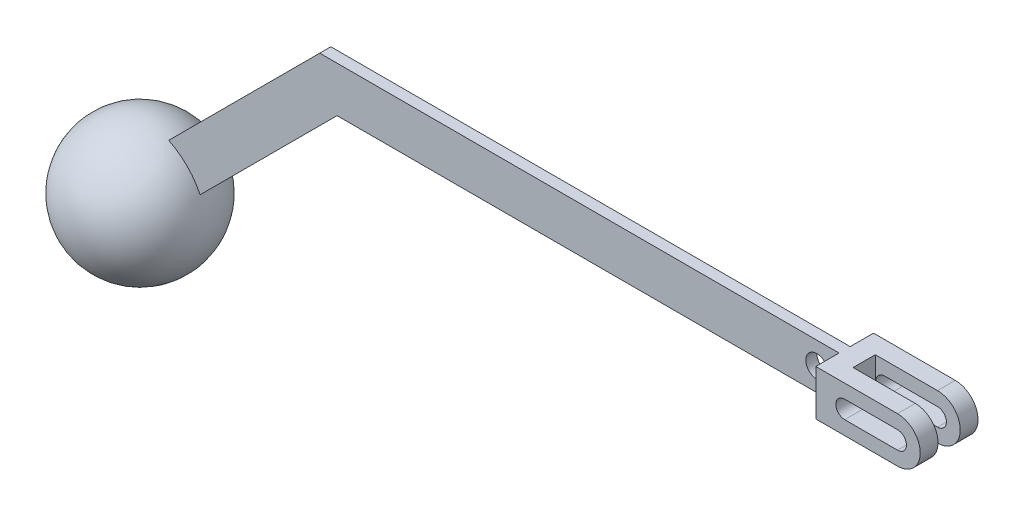
ISO-10303-21;
HEADER;
FILE_DESCRIPTION(('STEP AP214'),'2;1');
FILE_NAME('part.step','',(''),(''),'','','');
FILE_SCHEMA(('AUTOMOTIVE_DESIGN { 1 0 10303 214 1 1 1 1 }'));
ENDSEC;
DATA;
#1=APPLICATION_CONTEXT('core data for automotive mechanical design processes');
#2=APPLICATION_PROTOCOL_DEFINITION('international standard','automotive_design',2000,#1);
#3=PRODUCT_CONTEXT('',#1,'mechanical');
#4=PRODUCT('Part','Part','',(#3));
#5=PRODUCT_RELATED_PRODUCT_CATEGORY('part','',(#4));
#6=PRODUCT_DEFINITION_FORMATION('','',#4);
#7=PRODUCT_DEFINITION_CONTEXT('part definition',#1,'design');
#8=PRODUCT_DEFINITION('design','',#6,#7);
#9=PRODUCT_DEFINITION_SHAPE('','',#8);
#10=(LENGTH_UNIT() NAMED_UNIT(*) SI_UNIT(.MILLI.,.METRE.));
#11=(NAMED_UNIT(*) PLANE_ANGLE_UNIT() SI_UNIT($,.RADIAN.));
#12=(NAMED_UNIT(*) SI_UNIT($,.STERADIAN.) SOLID_ANGLE_UNIT());
#13=UNCERTAINTY_MEASURE_WITH_UNIT(LENGTH_MEASURE(1.E-05),#10,'distance_accuracy_value','');
#14=(GEOMETRIC_REPRESENTATION_CONTEXT(3) GLOBAL_UNCERTAINTY_ASSIGNED_CONTEXT((#13)) GLOBAL_UNIT_ASSIGNED_CONTEXT((#10,
#11,#12)) REPRESENTATION_CONTEXT('',''));
#15=CARTESIAN_POINT('',(0.,0.,0.));
#16=DIRECTION('',(0.,0.,1.));
#17=DIRECTION('',(1.,0.,0.));
#18=AXIS2_PLACEMENT_3D('',#15,#16,#17);
#19=CARTESIAN_POINT('',(29.1954306267144,4.,5.));
#20=DIRECTION('',(0.,-1.,0.));
#21=DIRECTION('',(0.,0.,-1.));
#22=AXIS2_PLACEMENT_3D('',#19,#20,#21);
#23=PLANE('',#22);
#24=DIRECTION('',(-1.,0.,0.));
#25=VECTOR('',#24,1.);
#26=CARTESIAN_POINT('',(29.1954306267144,4.,7.5));
#27=LINE('',#26,#25);
#28=CARTESIAN_POINT('',(8.,4.,7.5));
#29=VERTEX_POINT('',#28);
#30=CARTESIAN_POINT('',(-15.8045693732856,4.,7.5));
#31=VERTEX_POINT('',#30);
#32=EDGE_CURVE('E295',#29,#31,#27,.T.);
#33=ORIENTED_EDGE('',*,*,#32,.F.);
#34=DIRECTION('',(0.,0.,1.));
#35=VECTOR('',#34,1.);
#36=CARTESIAN_POINT('',(8.,4.,-39.4485108999575));
#37=LINE('',#36,#35);
#38=CARTESIAN_POINT('',(8.,4.,15.5));
#39=VERTEX_POINT('',#38);
#40=EDGE_CURVE('E342',#39,#29,#37,.F.);
#41=ORIENTED_EDGE('',*,*,#40,.F.);
#42=DIRECTION('',(1.,0.,0.));
#43=VECTOR('',#42,1.);
#44=CARTESIAN_POINT('',(29.1954306267144,4.,15.5));
#45=LINE('',#44,#43);
#46=CARTESIAN_POINT('',(-15.8045693732856,4.,15.5));
#47=VERTEX_POINT('',#46);
#48=EDGE_CURVE('E281',#47,#39,#45,.T.);
#49=ORIENTED_EDGE('',*,*,#48,.F.);
#50=DIRECTION('',(0.,0.,-1.));
#51=VECTOR('',#50,1.);
#52=CARTESIAN_POINT('',(-15.8045693732856,4.,5.));
#53=LINE('',#52,#51);
#54=EDGE_CURVE('E317',#47,#31,#53,.T.);
#55=ORIENTED_EDGE('',*,*,#54,.T.);
#56=EDGE_LOOP('',(#33,#41,#49,#55));
#57=FACE_BOUND('',#56,.T.);
#58=ADVANCED_FACE('F35',(#57),#23,.T.);
#59=CARTESIAN_POINT('',(8.,4.,-2.5));
#60=VERTEX_POINT('',#59);
#61=CARTESIAN_POINT('',(8.,4.,-10.5));
#62=VERTEX_POINT('',#61);
#63=EDGE_CURVE('E341',#60,#62,#37,.F.);
#64=ORIENTED_EDGE('',*,*,#63,.F.);
#65=DIRECTION('',(1.,0.,0.));
#66=VECTOR('',#65,1.);
#67=CARTESIAN_POINT('',(29.1954306267144,4.,-2.5));
#68=LINE('',#67,#66);
#69=CARTESIAN_POINT('',(-15.8045693732856,4.,-2.5));
#70=VERTEX_POINT('',#69);
#71=EDGE_CURVE('E291',#70,#60,#68,.T.);
#72=ORIENTED_EDGE('',*,*,#71,.F.);
#73=CARTESIAN_POINT('',(-15.8045693732856,4.,-10.5));
#74=VERTEX_POINT('',#73);
#75=EDGE_CURVE('E316',#70,#74,#53,.T.);
#76=ORIENTED_EDGE('',*,*,#75,.T.);
#77=DIRECTION('',(-1.,0.,0.));
#78=VECTOR('',#77,1.);
#79=CARTESIAN_POINT('',(29.1954306267144,4.,-10.5));
#80=LINE('',#79,#78);
#81=EDGE_CURVE('E265',#62,#74,#80,.T.);
#82=ORIENTED_EDGE('',*,*,#81,.F.);
#83=EDGE_LOOP('',(#64,#72,#76,#82));
#84=FACE_BOUND('',#83,.T.);
#85=ADVANCED_FACE('F431',(#84),#23,.T.);
#86=CARTESIAN_POINT('',(-15.8045693732856,-4.,5.));
#87=DIRECTION('',(0.,1.,0.));
#88=DIRECTION('',(0.,0.,1.));
#89=AXIS2_PLACEMENT_3D('',#86,#87,#88);
#90=PLANE('',#89);
#91=DIRECTION('',(0.,0.,1.));
#92=VECTOR('',#91,1.);
#93=CARTESIAN_POINT('',(8.,-4.,-39.4485108999575));
#94=LINE('',#93,#92);
#95=CARTESIAN_POINT('',(8.,-4.,15.5));
#96=VERTEX_POINT('',#95);
#97=CARTESIAN_POINT('',(8.,-4.,7.5));
#98=VERTEX_POINT('',#97);
#99=EDGE_CURVE('E338',#96,#98,#94,.F.);
#100=ORIENTED_EDGE('',*,*,#99,.T.);
#101=DIRECTION('',(1.,0.,0.));
#102=VECTOR('',#101,1.);
#103=CARTESIAN_POINT('',(-15.8045693732856,-4.,7.5));
#104=LINE('',#103,#102);
#105=CARTESIAN_POINT('',(-15.8045693732856,-4.,7.5));
#106=VERTEX_POINT('',#105);
#107=EDGE_CURVE('E57',#106,#98,#104,.T.);
#108=ORIENTED_EDGE('',*,*,#107,.F.);
#109=DIRECTION('',(0.,0.,-1.));
#110=VECTOR('',#109,1.);
#111=CARTESIAN_POINT('',(-15.8045693732856,-4.,5.));
#112=LINE('',#111,#110);
#113=CARTESIAN_POINT('',(-15.8045693732856,-4.,15.5));
#114=VERTEX_POINT('',#113);
#115=EDGE_CURVE('E314',#114,#106,#112,.T.);
#116=ORIENTED_EDGE('',*,*,#115,.F.);
#117=DIRECTION('',(-1.,0.,0.));
#118=VECTOR('',#117,1.);
#119=CARTESIAN_POINT('',(-15.8045693732856,-4.,15.5));
#120=LINE('',#119,#118);
#121=EDGE_CURVE('E277',#96,#114,#120,.T.);
#122=ORIENTED_EDGE('',*,*,#121,.F.);
#123=EDGE_LOOP('',(#100,#108,#116,#122));
#124=FACE_BOUND('',#123,.T.);
#125=ADVANCED_FACE('F362',(#124),#90,.T.);
#126=DIRECTION('',(-1.,0.,0.));
#127=VECTOR('',#126,1.);
#128=CARTESIAN_POINT('',(-15.8045693732856,-4.,-2.5));
#129=LINE('',#128,#127);
#130=CARTESIAN_POINT('',(8.,-4.,-2.5));
#131=VERTEX_POINT('',#130);
#132=CARTESIAN_POINT('',(-15.8045693732856,-4.,-2.5));
#133=VERTEX_POINT('',#132);
#134=EDGE_CURVE('E326',#131,#133,#129,.T.);
#135=ORIENTED_EDGE('',*,*,#134,.F.);
#136=CARTESIAN_POINT('',(8.,-4.,-10.5));
#137=VERTEX_POINT('',#136);
#138=EDGE_CURVE('E335',#131,#137,#94,.F.);
#139=ORIENTED_EDGE('',*,*,#138,.T.);
#140=DIRECTION('',(1.,0.,0.));
#141=VECTOR('',#140,1.);
#142=CARTESIAN_POINT('',(-15.8045693732856,-4.,-10.5));
#143=LINE('',#142,#141);
#144=CARTESIAN_POINT('',(-15.8045693732856,-4.,-10.5));
#145=VERTEX_POINT('',#144);
#146=EDGE_CURVE('E260',#145,#137,#143,.T.);
#147=ORIENTED_EDGE('',*,*,#146,.F.);
#148=EDGE_CURVE('E313',#133,#145,#112,.T.);
#149=ORIENTED_EDGE('',*,*,#148,.F.);
#150=EDGE_LOOP('',(#135,#139,#147,#149));
#151=FACE_BOUND('',#150,.T.);
#152=ADVANCED_FACE('F461',(#151),#90,.T.);
#153=CARTESIAN_POINT('',(8.,0.,-39.4485108999575));
#154=DIRECTION('',(0.,0.,1.));
#155=DIRECTION('',(1.,0.,0.));
#156=AXIS2_PLACEMENT_3D('',#153,#154,#155);
#157=CYLINDRICAL_SURFACE('',#156,10.2348441813063);
#158=DIRECTION('',(0.,0.,1.));
#159=VECTOR('',#158,1.);
#160=CARTESIAN_POINT('',(8.,-10.2348441813063,-17.5));
#161=LINE('',#160,#159);
#162=CARTESIAN_POINT('',(8.,-10.2348441813063,7.5));
#163=VERTEX_POINT('',#162);
#164=CARTESIAN_POINT('',(8.,-10.2348441813063,15.5));
#165=VERTEX_POINT('',#164);
#166=EDGE_CURVE('E219',#163,#165,#161,.T.);
#167=ORIENTED_EDGE('',*,*,#166,.F.);
#168=CARTESIAN_POINT('',(8.,0.,7.5));
#169=DIRECTION('',(0.,0.,-1.));
#170=DIRECTION('',(-1.,0.,0.));
#171=AXIS2_PLACEMENT_3D('',#168,#169,#170);
#172=CIRCLE('',#171,10.2348441813063);
#173=CARTESIAN_POINT('',(8.00000000000001,10.2348441813063,7.5));
#174=VERTEX_POINT('',#173);
#175=EDGE_CURVE('E217',#163,#174,#172,.F.);
#176=ORIENTED_EDGE('',*,*,#175,.T.);
#177=DIRECTION('',(0.,0.,1.));
#178=VECTOR('',#177,1.);
#179=CARTESIAN_POINT('',(8.,10.2348441813063,-17.5));
#180=LINE('',#179,#178);
#181=CARTESIAN_POINT('',(8.00000000000001,10.2348441813063,15.5));
#182=VERTEX_POINT('',#181);
#183=EDGE_CURVE('E220',#174,#182,#180,.T.);
#184=ORIENTED_EDGE('',*,*,#183,.T.);
#185=CARTESIAN_POINT('',(8.,0.,15.5));
#186=DIRECTION('',(0.,0.,1.));
#187=DIRECTION('',(1.,0.,0.));
#188=AXIS2_PLACEMENT_3D('',#185,#186,#187);
#189=CIRCLE('',#188,10.2348441813063);
#190=EDGE_CURVE('E230',#165,#182,#189,.T.);
#191=ORIENTED_EDGE('',*,*,#190,.F.);
#192=EDGE_LOOP('',(#167,#176,#184,#191));
#193=FACE_BOUND('',#192,.T.);
#194=ADVANCED_FACE('F378',(#193),#157,.T.);
#195=CARTESIAN_POINT('',(8.,10.2348441813063,-10.5));
#196=VERTEX_POINT('',#195);
#197=CARTESIAN_POINT('',(8.00000000000001,10.2348441813063,-2.5));
#198=VERTEX_POINT('',#197);
#199=EDGE_CURVE('E223',#196,#198,#180,.T.);
#200=ORIENTED_EDGE('',*,*,#199,.T.);
#201=CARTESIAN_POINT('',(8.,0.,-2.5));
#202=DIRECTION('',(0.,0.,1.));
#203=DIRECTION('',(0.,-1.,0.));
#204=AXIS2_PLACEMENT_3D('',#201,#202,#203);
#205=CIRCLE('',#204,10.2348441813063);
#206=CARTESIAN_POINT('',(8.,-10.2348441813063,-2.5));
#207=VERTEX_POINT('',#206);
#208=EDGE_CURVE('E215',#198,#207,#205,.F.);
#209=ORIENTED_EDGE('',*,*,#208,.T.);
#210=CARTESIAN_POINT('',(8.,-10.2348441813063,-10.5));
#211=VERTEX_POINT('',#210);
#212=EDGE_CURVE('E224',#211,#207,#161,.T.);
#213=ORIENTED_EDGE('',*,*,#212,.F.);
#214=CARTESIAN_POINT('',(8.,0.,-10.5));
#215=DIRECTION('',(0.,0.,1.));
#216=DIRECTION('',(0.,-1.,0.));
#217=AXIS2_PLACEMENT_3D('',#214,#215,#216);
#218=CIRCLE('',#217,10.2348441813063);
#219=EDGE_CURVE('E227',#196,#211,#218,.F.);
#220=ORIENTED_EDGE('',*,*,#219,.F.);
#221=EDGE_LOOP('',(#200,#209,#213,#220));
#222=FACE_BOUND('',#221,.T.);
#223=ADVANCED_FACE('F407',(#222),#157,.T.);
#224=CARTESIAN_POINT('',(8.,0.,-39.4485108999575));
#225=DIRECTION('',(0.,0.,1.));
#226=DIRECTION('',(1.,0.,0.));
#227=AXIS2_PLACEMENT_3D('',#224,#225,#226);
#228=CYLINDRICAL_SURFACE('',#227,4.);
#229=CARTESIAN_POINT('',(8.,0.,7.5));
#230=DIRECTION('',(0.,0.,-1.));
#231=DIRECTION('',(-1.,0.,0.));
#232=AXIS2_PLACEMENT_3D('',#229,#230,#231);
#233=CIRCLE('',#232,4.);
#234=EDGE_CURVE('E43',#98,#29,#233,.F.);
#235=ORIENTED_EDGE('',*,*,#234,.F.);
#236=ORIENTED_EDGE('',*,*,#99,.F.);
#237=CARTESIAN_POINT('',(8.,0.,15.5));
#238=DIRECTION('',(0.,0.,1.));
#239=DIRECTION('',(1.,0.,0.));
#240=AXIS2_PLACEMENT_3D('',#237,#238,#239);
#241=CIRCLE('',#240,4.);
#242=EDGE_CURVE('E231',#96,#39,#241,.T.);
#243=ORIENTED_EDGE('',*,*,#242,.T.);
#244=ORIENTED_EDGE('',*,*,#40,.T.);
#245=EDGE_LOOP('',(#235,#236,#243,#244));
#246=FACE_BOUND('',#245,.T.);
#247=ADVANCED_FACE('F351',(#246),#228,.F.);
#248=CARTESIAN_POINT('',(8.,0.,-2.5));
#249=DIRECTION('',(0.,0.,1.));
#250=DIRECTION('',(0.,-1.,0.));
#251=AXIS2_PLACEMENT_3D('',#248,#249,#250);
#252=CIRCLE('',#251,4.);
#253=EDGE_CURVE('E345',#60,#131,#252,.F.);
#254=ORIENTED_EDGE('',*,*,#253,.F.);
#255=ORIENTED_EDGE('',*,*,#63,.T.);
#256=CARTESIAN_POINT('',(8.,0.,-10.5));
#257=DIRECTION('',(0.,0.,1.));
#258=DIRECTION('',(0.,-1.,0.));
#259=AXIS2_PLACEMENT_3D('',#256,#257,#258);
#260=CIRCLE('',#259,4.);
#261=EDGE_CURVE('E229',#62,#137,#260,.F.);
#262=ORIENTED_EDGE('',*,*,#261,.T.);
#263=ORIENTED_EDGE('',*,*,#138,.F.);
#264=EDGE_LOOP('',(#254,#255,#262,#263));
#265=FACE_BOUND('',#264,.T.);
#266=ADVANCED_FACE('F449',(#265),#228,.F.);
#267=CARTESIAN_POINT('',(29.1954306267144,-10.2348441813063,5.));
#268=DIRECTION('',(0.,1.,0.));
#269=DIRECTION('',(0.,0.,1.));
#270=AXIS2_PLACEMENT_3D('',#267,#268,#269);
#271=PLANE('',#270);
#272=DIRECTION('',(1.,0.,0.));
#273=VECTOR('',#272,1.);
#274=CARTESIAN_POINT('',(-260.804569373286,-10.2348441813063,5.));
#275=LINE('',#274,#273);
#276=CARTESIAN_POINT('',(-254.897277930861,-10.2348441813063,5.));
#277=VERTEX_POINT('',#276);
#278=CARTESIAN_POINT('',(-28.8288741067103,-10.2348441813063,5.));
#279=VERTEX_POINT('',#278);
#280=EDGE_CURVE('E323',#277,#279,#275,.T.);
#281=ORIENTED_EDGE('',*,*,#280,.F.);
#282=DIRECTION('',(0.,0.,1.));
#283=VECTOR('',#282,1.);
#284=CARTESIAN_POINT('',(-254.897277930861,-10.2348441813063,-140.071478045431));
#285=LINE('',#284,#283);
#286=CARTESIAN_POINT('',(-254.897277930861,-10.2348441813064,0.));
#287=VERTEX_POINT('',#286);
#288=EDGE_CURVE('E201',#287,#277,#285,.T.);
#289=ORIENTED_EDGE('',*,*,#288,.F.);
#290=DIRECTION('',(1.,0.,0.));
#291=VECTOR('',#290,1.);
#292=CARTESIAN_POINT('',(29.1954306267144,-10.2348441813063,0.));
#293=LINE('',#292,#291);
#294=CARTESIAN_POINT('',(-28.8288741067103,-10.2348441813063,0.));
#295=VERTEX_POINT('',#294);
#296=EDGE_CURVE('E320',#287,#295,#293,.T.);
#297=ORIENTED_EDGE('',*,*,#296,.T.);
#298=DIRECTION('',(0.,0.,1.));
#299=VECTOR('',#298,1.);
#300=CARTESIAN_POINT('',(-28.8288741067103,-10.2348441813063,-20.));
#301=LINE('',#300,#299);
#302=CARTESIAN_POINT('',(-28.8288741067103,-10.2348441813063,-10.5));
#303=VERTEX_POINT('',#302);
#304=EDGE_CURVE('E302',#303,#295,#301,.T.);
#305=ORIENTED_EDGE('',*,*,#304,.F.);
#306=DIRECTION('',(1.,0.,0.));
#307=VECTOR('',#306,1.);
#308=CARTESIAN_POINT('',(29.1954306267144,-10.2348441813063,-10.5));
#309=LINE('',#308,#307);
#310=EDGE_CURVE('E269',#303,#211,#309,.T.);
#311=ORIENTED_EDGE('',*,*,#310,.T.);
#312=ORIENTED_EDGE('',*,*,#212,.T.);
#313=DIRECTION('',(1.,0.,0.));
#314=VECTOR('',#313,1.);
#315=CARTESIAN_POINT('',(29.1954306267144,-10.2348441813063,-2.5));
#316=LINE('',#315,#314);
#317=CARTESIAN_POINT('',(-20.,-10.2348441813063,-2.5));
#318=VERTEX_POINT('',#317);
#319=EDGE_CURVE('E239',#318,#207,#316,.T.);
#320=ORIENTED_EDGE('',*,*,#319,.F.);
#321=DIRECTION('',(0.,0.,-1.));
#322=VECTOR('',#321,1.);
#323=CARTESIAN_POINT('',(-20.,-10.2348441813063,5.));
#324=LINE('',#323,#322);
#325=CARTESIAN_POINT('',(-20.,-10.2348441813063,7.5));
#326=VERTEX_POINT('',#325);
#327=EDGE_CURVE('E250',#326,#318,#324,.T.);
#328=ORIENTED_EDGE('',*,*,#327,.F.);
#329=DIRECTION('',(-1.,0.,0.));
#330=VECTOR('',#329,1.);
#331=CARTESIAN_POINT('',(29.1954306267144,-10.2348441813063,7.5));
#332=LINE('',#331,#330);
#333=EDGE_CURVE('E242',#163,#326,#332,.T.);
#334=ORIENTED_EDGE('',*,*,#333,.F.);
#335=ORIENTED_EDGE('',*,*,#166,.T.);
#336=DIRECTION('',(-1.,0.,0.));
#337=VECTOR('',#336,1.);
#338=CARTESIAN_POINT('',(29.1954306267144,-10.2348441813063,15.5));
#339=LINE('',#338,#337);
#340=CARTESIAN_POINT('',(-28.8288741067103,-10.2348441813063,15.5));
#341=VERTEX_POINT('',#340);
#342=EDGE_CURVE('E275',#165,#341,#339,.T.);
#343=ORIENTED_EDGE('',*,*,#342,.T.);
#344=DIRECTION('',(0.,0.,-1.));
#345=VECTOR('',#344,1.);
#346=CARTESIAN_POINT('',(-28.8288741067103,-10.2348441813063,25.));
#347=LINE('',#346,#345);
#348=EDGE_CURVE('E308',#341,#279,#347,.T.);
#349=ORIENTED_EDGE('',*,*,#348,.T.);
#350=EDGE_LOOP('',(#281,#289,#297,#305,#311,#312,#320,#328,#334,#335,#343,#349));
#351=FACE_BOUND('',#350,.T.);
#352=ADVANCED_FACE('F37',(#351),#271,.F.);
#353=CARTESIAN_POINT('',(-52.6472735149724,10.2348441813063,5.));
#354=DIRECTION('',(0.,-1.,0.));
#355=DIRECTION('',(1.,0.,0.));
#356=AXIS2_PLACEMENT_3D('',#353,#354,#355);
#357=PLANE('',#356);
#358=DIRECTION('',(-1.,0.,0.));
#359=VECTOR('',#358,1.);
#360=CARTESIAN_POINT('',(-52.6472735149724,10.2348441813063,0.));
#361=LINE('',#360,#359);
#362=CARTESIAN_POINT('',(-28.8288741067103,10.2348441813063,0.));
#363=VERTEX_POINT('',#362);
#364=CARTESIAN_POINT('',(-262.71186081571,10.2348441813063,0.));
#365=VERTEX_POINT('',#364);
#366=EDGE_CURVE('E324',#363,#365,#361,.T.);
#367=ORIENTED_EDGE('',*,*,#366,.T.);
#368=DIRECTION('',(0.,0.,1.));
#369=VECTOR('',#368,1.);
#370=CARTESIAN_POINT('',(-262.71186081571,10.2348441813063,-140.071478045431));
#371=LINE('',#370,#369);
#372=CARTESIAN_POINT('',(-262.71186081571,10.2348441813063,5.));
#373=VERTEX_POINT('',#372);
#374=EDGE_CURVE('E210',#365,#373,#371,.T.);
#375=ORIENTED_EDGE('',*,*,#374,.T.);
#376=DIRECTION('',(-1.,0.,0.));
#377=VECTOR('',#376,1.);
#378=CARTESIAN_POINT('',(-138.115348744524,10.2348441813063,5.));
#379=LINE('',#378,#377);
#380=CARTESIAN_POINT('',(-28.8288741067103,10.2348441813063,5.));
#381=VERTEX_POINT('',#380);
#382=EDGE_CURVE('E321',#381,#373,#379,.T.);
#383=ORIENTED_EDGE('',*,*,#382,.F.);
#384=DIRECTION('',(0.,0.,-1.));
#385=VECTOR('',#384,1.);
#386=CARTESIAN_POINT('',(-28.8288741067103,10.2348441813063,25.));
#387=LINE('',#386,#385);
#388=CARTESIAN_POINT('',(-28.8288741067103,10.2348441813063,15.5));
#389=VERTEX_POINT('',#388);
#390=EDGE_CURVE('E311',#389,#381,#387,.T.);
#391=ORIENTED_EDGE('',*,*,#390,.F.);
#392=DIRECTION('',(1.,0.,0.));
#393=VECTOR('',#392,1.);
#394=CARTESIAN_POINT('',(-52.6472735149724,10.2348441813063,15.5));
#395=LINE('',#394,#393);
#396=EDGE_CURVE('E272',#389,#182,#395,.T.);
#397=ORIENTED_EDGE('',*,*,#396,.T.);
#398=ORIENTED_EDGE('',*,*,#183,.F.);
#399=DIRECTION('',(1.,0.,0.));
#400=VECTOR('',#399,1.);
#401=CARTESIAN_POINT('',(-52.6472735149724,10.2348441813063,7.5));
#402=LINE('',#401,#400);
#403=CARTESIAN_POINT('',(-20.,10.2348441813063,7.5));
#404=VERTEX_POINT('',#403);
#405=EDGE_CURVE('E244',#404,#174,#402,.T.);
#406=ORIENTED_EDGE('',*,*,#405,.F.);
#407=DIRECTION('',(0.,0.,1.));
#408=VECTOR('',#407,1.);
#409=CARTESIAN_POINT('',(-20.,10.2348441813063,5.));
#410=LINE('',#409,#408);
#411=CARTESIAN_POINT('',(-20.,10.2348441813063,-2.5));
#412=VERTEX_POINT('',#411);
#413=EDGE_CURVE('E247',#412,#404,#410,.T.);
#414=ORIENTED_EDGE('',*,*,#413,.F.);
#415=DIRECTION('',(-1.,0.,0.));
#416=VECTOR('',#415,1.);
#417=CARTESIAN_POINT('',(-52.6472735149724,10.2348441813063,-2.5));
#418=LINE('',#417,#416);
#419=EDGE_CURVE('E237',#198,#412,#418,.T.);
#420=ORIENTED_EDGE('',*,*,#419,.F.);
#421=ORIENTED_EDGE('',*,*,#199,.F.);
#422=DIRECTION('',(-1.,0.,0.));
#423=VECTOR('',#422,1.);
#424=CARTESIAN_POINT('',(-52.6472735149724,10.2348441813063,-10.5));
#425=LINE('',#424,#423);
#426=CARTESIAN_POINT('',(-28.8288741067103,10.2348441813063,-10.5));
#427=VERTEX_POINT('',#426);
#428=EDGE_CURVE('E267',#196,#427,#425,.T.);
#429=ORIENTED_EDGE('',*,*,#428,.T.);
#430=DIRECTION('',(0.,0.,1.));
#431=VECTOR('',#430,1.);
#432=CARTESIAN_POINT('',(-28.8288741067103,10.2348441813063,-20.));
#433=LINE('',#432,#431);
#434=EDGE_CURVE('E300',#427,#363,#433,.T.);
#435=ORIENTED_EDGE('',*,*,#434,.T.);
#436=EDGE_LOOP('',(#367,#375,#383,#391,#397,#398,#406,#414,#420,#421,#429,#435));
#437=FACE_BOUND('',#436,.T.);
#438=ADVANCED_FACE('F383',(#437),#357,.F.);
#439=CARTESIAN_POINT('',(-15.8045693732856,0.,5.));
#440=DIRECTION('',(0.,0.,-1.));
#441=DIRECTION('',(-1.,0.,0.));
#442=AXIS2_PLACEMENT_3D('',#439,#440,#441);
#443=CYLINDRICAL_SURFACE('',#442,4.);
#444=CARTESIAN_POINT('',(-15.8045693732856,0.,15.5));
#445=DIRECTION('',(0.,0.,-1.));
#446=DIRECTION('',(0.,1.,0.));
#447=AXIS2_PLACEMENT_3D('',#444,#445,#446);
#448=CIRCLE('',#447,4.);
#449=EDGE_CURVE('E279',#114,#47,#448,.T.);
#450=ORIENTED_EDGE('',*,*,#449,.F.);
#451=ORIENTED_EDGE('',*,*,#115,.T.);
#452=CARTESIAN_POINT('',(-15.8045693732856,0.,7.5));
#453=DIRECTION('',(0.,0.,1.));
#454=DIRECTION('',(0.,-1.,0.));
#455=AXIS2_PLACEMENT_3D('',#452,#453,#454);
#456=CIRCLE('',#455,4.);
#457=EDGE_CURVE('E293',#31,#106,#456,.T.);
#458=ORIENTED_EDGE('',*,*,#457,.F.);
#459=ORIENTED_EDGE('',*,*,#54,.F.);
#460=EDGE_LOOP('',(#450,#451,#458,#459));
#461=FACE_BOUND('',#460,.T.);
#462=ADVANCED_FACE('F359',(#461),#443,.F.);
#463=CARTESIAN_POINT('',(29.1954306267144,0.,5.));
#464=DIRECTION('',(0.,0.,1.));
#465=DIRECTION('',(1.,0.,0.));
#466=AXIS2_PLACEMENT_3D('',#463,#464,#465);
#467=PLANE('',#466);
#468=DIRECTION('',(-0.707106781186551,-0.707106781186544,0.));
#469=VECTOR('',#468,1.);
#470=CARTESIAN_POINT('',(-350.728450927537,-77.7817459305198,5.));
#471=LINE('',#470,#469);
#472=CARTESIAN_POINT('',(-330.728450927537,-57.7817459305198,5.));
#473=VERTEX_POINT('',#472);
#474=EDGE_CURVE('E196',#373,#473,#471,.T.);
#475=ORIENTED_EDGE('',*,*,#474,.T.);
#476=CARTESIAN_POINT('',(-343.657383115672,-84.8528137423853,5.));
#477=DIRECTION('',(0.,0.,1.));
#478=DIRECTION('',(1.,0.,0.));
#479=AXIS2_PLACEMENT_3D('',#476,#477,#478);
#480=CIRCLE('',#479,30.);
#481=CARTESIAN_POINT('',(-316.586315303806,-71.9238815542509,5.));
#482=VERTEX_POINT('',#481);
#483=EDGE_CURVE('E184',#473,#482,#480,.F.);
#484=ORIENTED_EDGE('',*,*,#483,.T.);
#485=DIRECTION('',(0.707106781186551,0.707106781186544,0.));
#486=VECTOR('',#485,1.);
#487=CARTESIAN_POINT('',(-336.586315303806,-91.9238815542507,5.));
#488=LINE('',#487,#486);
#489=EDGE_CURVE('E193',#482,#277,#488,.T.);
#490=ORIENTED_EDGE('',*,*,#489,.T.);
#491=ORIENTED_EDGE('',*,*,#280,.T.);
#492=DIRECTION('',(0.,-1.,0.));
#493=VECTOR('',#492,1.);
#494=CARTESIAN_POINT('',(-28.8288741067103,10.2348441813063,5.));
#495=LINE('',#494,#493);
#496=EDGE_CURVE('E305',#381,#279,#495,.T.);
#497=ORIENTED_EDGE('',*,*,#496,.F.);
#498=ORIENTED_EDGE('',*,*,#382,.T.);
#499=EDGE_LOOP('',(#475,#484,#490,#491,#497,#498));
#500=FACE_BOUND('',#499,.T.);
#501=CARTESIAN_POINT('',(-38.8288741067103,0.,5.));
#502=DIRECTION('',(0.,0.,1.));
#503=DIRECTION('',(1.,0.,0.));
#504=AXIS2_PLACEMENT_3D('',#501,#502,#503);
#505=CIRCLE('',#504,5.);
#506=CARTESIAN_POINT('',(-33.8288741067103,0.,5.));
#507=VERTEX_POINT('',#506);
#508=EDGE_CURVE('E253',#507,#507,#505,.T.);
#509=ORIENTED_EDGE('',*,*,#508,.F.);
#510=EDGE_LOOP('',(#509));
#511=FACE_BOUND('',#510,.T.);
#512=ADVANCED_FACE('F191',(#500,#511),#467,.T.);
#513=CARTESIAN_POINT('',(29.1954306267144,0.,0.));
#514=DIRECTION('',(0.,0.,1.));
#515=DIRECTION('',(1.,0.,0.));
#516=AXIS2_PLACEMENT_3D('',#513,#514,#515);
#517=PLANE('',#516);
#518=CARTESIAN_POINT('',(-343.657383115672,-84.8528137423853,0.));
#519=DIRECTION('',(0.,0.,1.));
#520=DIRECTION('',(1.,0.,0.));
#521=AXIS2_PLACEMENT_3D('',#518,#519,#520);
#522=CIRCLE('',#521,29.5803989154981);
#523=CARTESIAN_POINT('',(-331.043431242507,-58.0967262454903,0.));
#524=VERTEX_POINT('',#523);
#525=CARTESIAN_POINT('',(-316.901295618777,-72.2388618692214,0.));
#526=VERTEX_POINT('',#525);
#527=EDGE_CURVE('E50',#524,#526,#522,.F.);
#528=ORIENTED_EDGE('',*,*,#527,.F.);
#529=DIRECTION('',(0.707106781186551,0.707106781186544,0.));
#530=VECTOR('',#529,1.);
#531=CARTESIAN_POINT('',(-350.728450927537,-77.7817459305198,0.));
#532=LINE('',#531,#530);
#533=EDGE_CURVE('E207',#524,#365,#532,.T.);
#534=ORIENTED_EDGE('',*,*,#533,.T.);
#535=ORIENTED_EDGE('',*,*,#366,.F.);
#536=DIRECTION('',(0.,-1.,0.));
#537=VECTOR('',#536,1.);
#538=CARTESIAN_POINT('',(-28.8288741067103,10.2348441813063,0.));
#539=LINE('',#538,#537);
#540=EDGE_CURVE('E297',#363,#295,#539,.T.);
#541=ORIENTED_EDGE('',*,*,#540,.T.);
#542=ORIENTED_EDGE('',*,*,#296,.F.);
#543=DIRECTION('',(-0.707106781186551,-0.707106781186544,0.));
#544=VECTOR('',#543,1.);
#545=CARTESIAN_POINT('',(-336.586315303806,-91.9238815542507,0.));
#546=LINE('',#545,#544);
#547=EDGE_CURVE('E213',#287,#526,#546,.T.);
#548=ORIENTED_EDGE('',*,*,#547,.T.);
#549=EDGE_LOOP('',(#528,#534,#535,#541,#542,#548));
#550=FACE_BOUND('',#549,.T.);
#551=CARTESIAN_POINT('',(-38.8288741067103,0.,0.));
#552=DIRECTION('',(0.,0.,1.));
#553=DIRECTION('',(1.,0.,0.));
#554=AXIS2_PLACEMENT_3D('',#551,#552,#553);
#555=CIRCLE('',#554,5.);
#556=CARTESIAN_POINT('',(-33.8288741067103,0.,0.));
#557=VERTEX_POINT('',#556);
#558=EDGE_CURVE('E256',#557,#557,#555,.T.);
#559=ORIENTED_EDGE('',*,*,#558,.T.);
#560=EDGE_LOOP('',(#559));
#561=FACE_BOUND('',#560,.T.);
#562=ADVANCED_FACE('F391',(#550,#561),#517,.F.);
#563=CARTESIAN_POINT('',(-15.8045693732856,0.,-10.5));
#564=DIRECTION('',(0.,0.,1.));
#565=DIRECTION('',(0.,-1.,0.));
#566=AXIS2_PLACEMENT_3D('',#563,#564,#565);
#567=CIRCLE('',#566,4.);
#568=EDGE_CURVE('E263',#74,#145,#567,.T.);
#569=ORIENTED_EDGE('',*,*,#568,.F.);
#570=ORIENTED_EDGE('',*,*,#75,.F.);
#571=CARTESIAN_POINT('',(-15.8045693732856,0.,-2.5));
#572=DIRECTION('',(0.,0.,-1.));
#573=DIRECTION('',(0.,1.,0.));
#574=AXIS2_PLACEMENT_3D('',#571,#572,#573);
#575=CIRCLE('',#574,4.);
#576=EDGE_CURVE('E289',#133,#70,#575,.T.);
#577=ORIENTED_EDGE('',*,*,#576,.F.);
#578=ORIENTED_EDGE('',*,*,#148,.T.);
#579=EDGE_LOOP('',(#569,#570,#577,#578));
#580=FACE_BOUND('',#579,.T.);
#581=ADVANCED_FACE('F439',(#580),#443,.F.);
#582=CARTESIAN_POINT('',(-28.8288741067103,10.2348441813063,25.));
#583=DIRECTION('',(1.,0.,0.));
#584=DIRECTION('',(0.,1.,0.));
#585=AXIS2_PLACEMENT_3D('',#582,#583,#584);
#586=PLANE('',#585);
#587=ORIENTED_EDGE('',*,*,#348,.F.);
#588=DIRECTION('',(0.,1.,0.));
#589=VECTOR('',#588,1.);
#590=CARTESIAN_POINT('',(-28.8288741067103,10.2348441813063,15.5));
#591=LINE('',#590,#589);
#592=EDGE_CURVE('E332',#341,#389,#591,.T.);
#593=ORIENTED_EDGE('',*,*,#592,.T.);
#594=ORIENTED_EDGE('',*,*,#390,.T.);
#595=ORIENTED_EDGE('',*,*,#496,.T.);
#596=EDGE_LOOP('',(#587,#593,#594,#595));
#597=FACE_BOUND('',#596,.T.);
#598=ADVANCED_FACE('F386',(#597),#586,.F.);
#599=CARTESIAN_POINT('',(-28.8288741067103,10.2348441813063,-20.));
#600=DIRECTION('',(-1.,0.,0.));
#601=DIRECTION('',(0.,-1.,0.));
#602=AXIS2_PLACEMENT_3D('',#599,#600,#601);
#603=PLANE('',#602);
#604=DIRECTION('',(0.,1.,0.));
#605=VECTOR('',#604,1.);
#606=CARTESIAN_POINT('',(-28.8288741067103,22.9279109127552,-10.5));
#607=LINE('',#606,#605);
#608=EDGE_CURVE('E257',#303,#427,#607,.T.);
#609=ORIENTED_EDGE('',*,*,#608,.F.);
#610=ORIENTED_EDGE('',*,*,#304,.T.);
#611=ORIENTED_EDGE('',*,*,#540,.F.);
#612=ORIENTED_EDGE('',*,*,#434,.F.);
#613=EDGE_LOOP('',(#609,#610,#611,#612));
#614=FACE_BOUND('',#613,.T.);
#615=ADVANCED_FACE('F398',(#614),#603,.T.);
#616=CARTESIAN_POINT('',(-20.,10.,7.5));
#617=DIRECTION('',(0.,0.,1.));
#618=DIRECTION('',(0.,-1.,0.));
#619=AXIS2_PLACEMENT_3D('',#616,#617,#618);
#620=PLANE('',#619);
#621=ORIENTED_EDGE('',*,*,#175,.F.);
#622=ORIENTED_EDGE('',*,*,#333,.T.);
#623=DIRECTION('',(0.,-1.,0.));
#624=VECTOR('',#623,1.);
#625=CARTESIAN_POINT('',(-20.,10.,7.5));
#626=LINE('',#625,#624);
#627=EDGE_CURVE('E283',#404,#326,#626,.T.);
#628=ORIENTED_EDGE('',*,*,#627,.F.);
#629=ORIENTED_EDGE('',*,*,#405,.T.);
#630=EDGE_LOOP('',(#621,#622,#628,#629));
#631=FACE_BOUND('',#630,.T.);
#632=ORIENTED_EDGE('',*,*,#107,.T.);
#633=ORIENTED_EDGE('',*,*,#234,.T.);
#634=ORIENTED_EDGE('',*,*,#32,.T.);
#635=ORIENTED_EDGE('',*,*,#457,.T.);
#636=EDGE_LOOP('',(#632,#633,#634,#635));
#637=FACE_BOUND('',#636,.T.);
#638=ADVANCED_FACE('F347',(#631,#637),#620,.F.);
#639=CARTESIAN_POINT('',(-20.,10.,-2.5));
#640=DIRECTION('',(0.,0.,-1.));
#641=DIRECTION('',(0.,1.,0.));
#642=AXIS2_PLACEMENT_3D('',#639,#640,#641);
#643=PLANE('',#642);
#644=ORIENTED_EDGE('',*,*,#253,.T.);
#645=ORIENTED_EDGE('',*,*,#134,.T.);
#646=ORIENTED_EDGE('',*,*,#576,.T.);
#647=ORIENTED_EDGE('',*,*,#71,.T.);
#648=EDGE_LOOP('',(#644,#645,#646,#647));
#649=FACE_BOUND('',#648,.T.);
#650=ORIENTED_EDGE('',*,*,#319,.T.);
#651=ORIENTED_EDGE('',*,*,#208,.F.);
#652=ORIENTED_EDGE('',*,*,#419,.T.);
#653=DIRECTION('',(0.,1.,0.));
#654=VECTOR('',#653,1.);
#655=CARTESIAN_POINT('',(-20.,10.,-2.5));
#656=LINE('',#655,#654);
#657=EDGE_CURVE('E286',#318,#412,#656,.T.);
#658=ORIENTED_EDGE('',*,*,#657,.F.);
#659=EDGE_LOOP('',(#650,#651,#652,#658));
#660=FACE_BOUND('',#659,.T.);
#661=ADVANCED_FACE('F410',(#649,#660),#643,.F.);
#662=CARTESIAN_POINT('',(-20.,0.,0.));
#663=DIRECTION('',(1.,0.,0.));
#664=DIRECTION('',(0.,0.,-1.));
#665=AXIS2_PLACEMENT_3D('',#662,#663,#664);
#666=PLANE('',#665);
#667=ORIENTED_EDGE('',*,*,#627,.T.);
#668=ORIENTED_EDGE('',*,*,#327,.T.);
#669=ORIENTED_EDGE('',*,*,#657,.T.);
#670=ORIENTED_EDGE('',*,*,#413,.T.);
#671=EDGE_LOOP('',(#667,#668,#669,#670));
#672=FACE_BOUND('',#671,.T.);
#673=ADVANCED_FACE('F412',(#672),#666,.T.);
#674=CARTESIAN_POINT('',(-82.5198381212025,22.9279109127552,-10.5));
#675=DIRECTION('',(0.,0.,1.));
#676=DIRECTION('',(0.,-1.,0.));
#677=AXIS2_PLACEMENT_3D('',#674,#675,#676);
#678=PLANE('',#677);
#679=ORIENTED_EDGE('',*,*,#261,.F.);
#680=ORIENTED_EDGE('',*,*,#81,.T.);
#681=ORIENTED_EDGE('',*,*,#568,.T.);
#682=ORIENTED_EDGE('',*,*,#146,.T.);
#683=EDGE_LOOP('',(#679,#680,#681,#682));
#684=FACE_BOUND('',#683,.T.);
#685=ORIENTED_EDGE('',*,*,#428,.F.);
#686=ORIENTED_EDGE('',*,*,#219,.T.);
#687=ORIENTED_EDGE('',*,*,#310,.F.);
#688=ORIENTED_EDGE('',*,*,#608,.T.);
#689=EDGE_LOOP('',(#685,#686,#687,#688));
#690=FACE_BOUND('',#689,.T.);
#691=ADVANCED_FACE('F368',(#684,#690),#678,.F.);
#692=CARTESIAN_POINT('',(-82.5198381212025,21.3005368225172,15.5));
#693=DIRECTION('',(0.,0.,-1.));
#694=DIRECTION('',(0.,1.,0.));
#695=AXIS2_PLACEMENT_3D('',#692,#693,#694);
#696=PLANE('',#695);
#697=ORIENTED_EDGE('',*,*,#48,.T.);
#698=ORIENTED_EDGE('',*,*,#242,.F.);
#699=ORIENTED_EDGE('',*,*,#121,.T.);
#700=ORIENTED_EDGE('',*,*,#449,.T.);
#701=EDGE_LOOP('',(#697,#698,#699,#700));
#702=FACE_BOUND('',#701,.T.);
#703=ORIENTED_EDGE('',*,*,#342,.F.);
#704=ORIENTED_EDGE('',*,*,#190,.T.);
#705=ORIENTED_EDGE('',*,*,#396,.F.);
#706=ORIENTED_EDGE('',*,*,#592,.F.);
#707=EDGE_LOOP('',(#703,#704,#705,#706));
#708=FACE_BOUND('',#707,.T.);
#709=ADVANCED_FACE('F364',(#702,#708),#696,.F.);
#710=CARTESIAN_POINT('',(-38.8288741067103,0.,-17.5));
#711=DIRECTION('',(0.,0.,1.));
#712=DIRECTION('',(1.,0.,0.));
#713=AXIS2_PLACEMENT_3D('',#710,#711,#712);
#714=CYLINDRICAL_SURFACE('',#713,5.);
#715=CARTESIAN_POINT('',(-33.8288741067103,0.,5.));
#716=CARTESIAN_POINT('',(-33.8288741067103,0.,4.94791666666667));
#717=CARTESIAN_POINT('',(-33.8288741067103,0.,4.89583333333333));
#718=CARTESIAN_POINT('',(-33.8288741067103,0.,4.79166666666667));
#719=CARTESIAN_POINT('',(-33.8288741067103,0.,4.73958333333333));
#720=CARTESIAN_POINT('',(-33.8288741067103,0.,4.63541666666667));
#721=CARTESIAN_POINT('',(-33.8288741067103,0.,4.58333333333333));
#722=CARTESIAN_POINT('',(-33.8288741067103,0.,4.47916666666667));
#723=CARTESIAN_POINT('',(-33.8288741067103,0.,4.42708333333333));
#724=CARTESIAN_POINT('',(-33.8288741067103,0.,4.32291666666667));
#725=CARTESIAN_POINT('',(-33.8288741067103,0.,4.27083333333333));
#726=CARTESIAN_POINT('',(-33.8288741067103,0.,4.16666666666667));
#727=CARTESIAN_POINT('',(-33.8288741067103,0.,4.11458333333333));
#728=CARTESIAN_POINT('',(-33.8288741067103,0.,4.01041666666667));
#729=CARTESIAN_POINT('',(-33.8288741067103,0.,3.95833333333333));
#730=CARTESIAN_POINT('',(-33.8288741067103,0.,3.85416666666667));
#731=CARTESIAN_POINT('',(-33.8288741067103,0.,3.80208333333333));
#732=CARTESIAN_POINT('',(-33.8288741067103,0.,3.69791666666667));
#733=CARTESIAN_POINT('',(-33.8288741067103,0.,3.64583333333333));
#734=CARTESIAN_POINT('',(-33.8288741067103,0.,3.54166666666667));
#735=CARTESIAN_POINT('',(-33.8288741067103,0.,3.48958333333333));
#736=CARTESIAN_POINT('',(-33.8288741067103,0.,3.38541666666667));
#737=CARTESIAN_POINT('',(-33.8288741067103,0.,3.33333333333333));
#738=CARTESIAN_POINT('',(-33.8288741067103,0.,3.22916666666667));
#739=CARTESIAN_POINT('',(-33.8288741067103,0.,3.17708333333333));
#740=CARTESIAN_POINT('',(-33.8288741067103,0.,3.07291666666667));
#741=CARTESIAN_POINT('',(-33.8288741067103,0.,3.02083333333333));
#742=CARTESIAN_POINT('',(-33.8288741067103,0.,2.91666666666667));
#743=CARTESIAN_POINT('',(-33.8288741067103,0.,2.86458333333333));
#744=CARTESIAN_POINT('',(-33.8288741067103,0.,2.76041666666667));
#745=CARTESIAN_POINT('',(-33.8288741067103,0.,2.70833333333333));
#746=CARTESIAN_POINT('',(-33.8288741067103,0.,2.60416666666667));
#747=CARTESIAN_POINT('',(-33.8288741067103,0.,2.55208333333333));
#748=CARTESIAN_POINT('',(-33.8288741067103,0.,2.44791666666667));
#749=CARTESIAN_POINT('',(-33.8288741067103,0.,2.39583333333333));
#750=CARTESIAN_POINT('',(-33.8288741067103,0.,2.29166666666667));
#751=CARTESIAN_POINT('',(-33.8288741067103,0.,2.23958333333333));
#752=CARTESIAN_POINT('',(-33.8288741067103,0.,2.13541666666667));
#753=CARTESIAN_POINT('',(-33.8288741067103,0.,2.08333333333333));
#754=CARTESIAN_POINT('',(-33.8288741067103,0.,1.97916666666667));
#755=CARTESIAN_POINT('',(-33.8288741067103,0.,1.92708333333333));
#756=CARTESIAN_POINT('',(-33.8288741067103,0.,1.82291666666666));
#757=CARTESIAN_POINT('',(-33.8288741067103,0.,1.77083333333333));
#758=CARTESIAN_POINT('',(-33.8288741067103,0.,1.66666666666666));
#759=CARTESIAN_POINT('',(-33.8288741067103,0.,1.61458333333333));
#760=CARTESIAN_POINT('',(-33.8288741067103,0.,1.51041666666666));
#761=CARTESIAN_POINT('',(-33.8288741067103,0.,1.45833333333333));
#762=CARTESIAN_POINT('',(-33.8288741067103,0.,1.35416666666666));
#763=CARTESIAN_POINT('',(-33.8288741067103,0.,1.30208333333333));
#764=CARTESIAN_POINT('',(-33.8288741067103,0.,1.19791666666666));
#765=CARTESIAN_POINT('',(-33.8288741067103,0.,1.14583333333333));
#766=CARTESIAN_POINT('',(-33.8288741067103,0.,1.04166666666666));
#767=CARTESIAN_POINT('',(-33.8288741067103,0.,0.989583333333331));
#768=CARTESIAN_POINT('',(-33.8288741067103,0.,0.885416666666664));
#769=CARTESIAN_POINT('',(-33.8288741067103,0.,0.833333333333331));
#770=CARTESIAN_POINT('',(-33.8288741067103,0.,0.729166666666664));
#771=CARTESIAN_POINT('',(-33.8288741067103,0.,0.67708333333333));
#772=CARTESIAN_POINT('',(-33.8288741067103,0.,0.572916666666664));
#773=CARTESIAN_POINT('',(-33.8288741067103,0.,0.52083333333333));
#774=CARTESIAN_POINT('',(-33.8288741067103,0.,0.416666666666664));
#775=CARTESIAN_POINT('',(-33.8288741067103,0.,0.36458333333333));
#776=CARTESIAN_POINT('',(-33.8288741067103,0.,0.260416666666663));
#777=CARTESIAN_POINT('',(-33.8288741067103,0.,0.20833333333333));
#778=CARTESIAN_POINT('',(-33.8288741067103,0.,0.104166666666663));
#779=CARTESIAN_POINT('',(-33.8288741067103,0.,0.05208333333333));
#780=CARTESIAN_POINT('',(-33.8288741067103,0.,0.));
#781=B_SPLINE_CURVE_WITH_KNOTS('',3,(#715,#716,#717,#718,#719,#720,#721,#722,#723,#724,#725,
#726,#727,#728,#729,#730,#731,#732,#733,#734,#735,#736,#737,#738,#739,#740,#741,#742,#743,#744,
#745,#746,#747,#748,#749,#750,#751,#752,#753,#754,#755,#756,#757,#758,#759,#760,#761,#762,#763,
#764,#765,#766,#767,#768,#769,#770,#771,#772,#773,#774,#775,#776,#777,#778,#779,#780),
.UNSPECIFIED.,.F.,.F.,(4,2,2,2,2,2,2,2,2,2,2,2,2,2,2,2,2,2,2,2,2,2,2,2,2,2,2,2,2,2,2,2,4),(0.,
0.15625,0.3125,0.46875,0.625000000000001,0.781250000000001,0.937500000000001,1.09375,1.25,
1.40625,1.5625,1.71875,1.875,2.03125,2.1875,2.34375,2.5,2.65625,2.8125,2.96875,3.125,3.28125,
3.4375,3.59375,3.75,3.90625,4.0625,4.21875,4.375,4.53125,4.6875,4.84375,5.),.UNSPECIFIED.);
#782=EDGE_CURVE('BSEAM367',#507,#557,#781,.T.);
#783=ORIENTED_EDGE('',*,*,#508,.T.);
#784=ORIENTED_EDGE('',*,*,#558,.F.);
#785=ORIENTED_EDGE('',*,*,#782,.T.);
#786=ORIENTED_EDGE('',*,*,#782,.F.);
#787=EDGE_LOOP('',(#783,#785,#784,#786));
#788=FACE_BOUND('',#787,.T.);
#789=ADVANCED_FACE('F367',(#788),#714,.F.);
#790=CARTESIAN_POINT('',(-350.728450927537,-77.7817459305198,-140.071478045431));
#791=DIRECTION('',(-0.707106781186544,0.707106781186551,0.));
#792=DIRECTION('',(-0.707106781186551,-0.707106781186544,0.));
#793=AXIS2_PLACEMENT_3D('',#790,#791,#792);
#794=PLANE('',#793);
#795=ORIENTED_EDGE('',*,*,#533,.F.);
#796=CARTESIAN_POINT('',(-350.728450927537,-77.7817459305197,5.));
#797=DIRECTION('',(-0.707106781186544,0.707106781186551,0.));
#798=DIRECTION('',(-0.707106781186551,-0.707106781186544,0.));
#799=AXIS2_PLACEMENT_3D('',#796,#797,#798);
#800=CIRCLE('',#799,28.2842712474619);
#801=EDGE_CURVE('E197',#524,#473,#800,.F.);
#802=ORIENTED_EDGE('',*,*,#801,.T.);
#803=ORIENTED_EDGE('',*,*,#474,.F.);
#804=ORIENTED_EDGE('',*,*,#374,.F.);
#805=EDGE_LOOP('',(#795,#802,#803,#804));
#806=FACE_BOUND('',#805,.T.);
#807=ADVANCED_FACE('F418',(#806),#794,.T.);
#808=CARTESIAN_POINT('',(-336.586315303806,-91.9238815542507,-140.071478045431));
#809=DIRECTION('',(0.707106781186544,-0.707106781186551,0.));
#810=DIRECTION('',(0.707106781186551,0.707106781186544,0.));
#811=AXIS2_PLACEMENT_3D('',#808,#809,#810);
#812=PLANE('',#811);
#813=ORIENTED_EDGE('',*,*,#489,.F.);
#814=CARTESIAN_POINT('',(-336.586315303806,-91.9238815542508,5.));
#815=DIRECTION('',(0.707106781186544,-0.707106781186551,0.));
#816=DIRECTION('',(0.707106781186551,0.707106781186544,0.));
#817=AXIS2_PLACEMENT_3D('',#814,#815,#816);
#818=CIRCLE('',#817,28.2842712474619);
#819=EDGE_CURVE('E11',#482,#526,#818,.F.);
#820=ORIENTED_EDGE('',*,*,#819,.T.);
#821=ORIENTED_EDGE('',*,*,#547,.F.);
#822=ORIENTED_EDGE('',*,*,#288,.T.);
#823=EDGE_LOOP('',(#813,#820,#821,#822));
#824=FACE_BOUND('',#823,.T.);
#825=ADVANCED_FACE('F199',(#824),#812,.T.);
#826=CARTESIAN_POINT('',(-343.657383115672,-84.8528137423853,5.));
#827=DIRECTION('',(-1.,0.,0.));
#828=DIRECTION('',(0.,1.,0.));
#829=AXIS2_PLACEMENT_3D('',#826,#827,#828);
#830=SPHERICAL_SURFACE('',#829,30.);
#831=ORIENTED_EDGE('',*,*,#801,.F.);
#832=ORIENTED_EDGE('',*,*,#527,.T.);
#833=ORIENTED_EDGE('',*,*,#819,.F.);
#834=ORIENTED_EDGE('',*,*,#483,.F.);
#835=EDGE_LOOP('',(#831,#832,#833,#834));
#836=FACE_BOUND('',#835,.T.);
#837=ADVANCED_FACE('F183',(#836),#830,.T.);
#838=CLOSED_SHELL('',(#58,#85,#125,#152,#194,#223,#247,#266,#352,#438,#462,#512,#562,#581,#598,
#615,#638,#661,#673,#691,#709,#789,#807,#825,#837));
#839=MANIFOLD_SOLID_BREP('B2',#838);
#840=ADVANCED_BREP_SHAPE_REPRESENTATION('',(#18,#839),#14);
#841=SHAPE_DEFINITION_REPRESENTATION(#9,#840);
ENDSEC;
END-ISO-10303-21;
